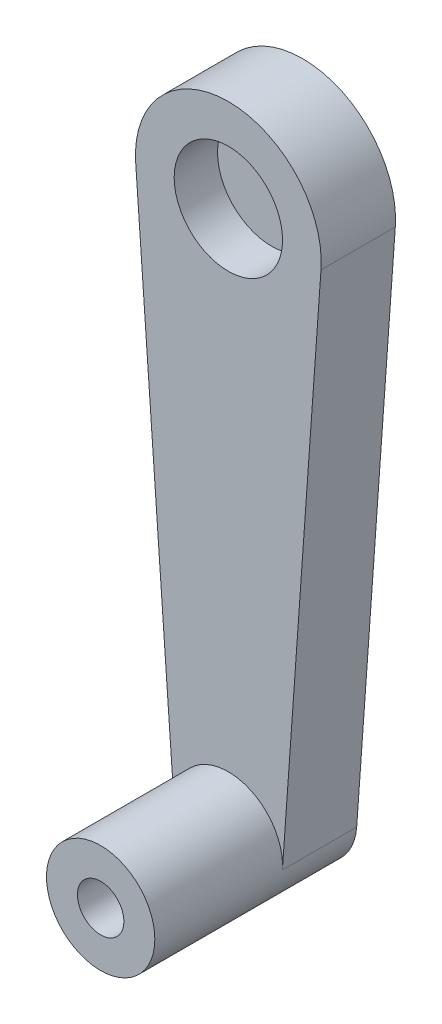
ISO-10303-21;
HEADER;
FILE_DESCRIPTION(('STEP AP214'),'2;1');
FILE_NAME('part.step','',(''),(''),'','','');
FILE_SCHEMA(('AUTOMOTIVE_DESIGN { 1 0 10303 214 1 1 1 1 }'));
ENDSEC;
DATA;
#1=APPLICATION_CONTEXT('core data for automotive mechanical design processes');
#2=APPLICATION_PROTOCOL_DEFINITION('international standard','automotive_design',2000,#1);
#3=PRODUCT_CONTEXT('',#1,'mechanical');
#4=PRODUCT('Part','Part','',(#3));
#5=PRODUCT_RELATED_PRODUCT_CATEGORY('part','',(#4));
#6=PRODUCT_DEFINITION_FORMATION('','',#4);
#7=PRODUCT_DEFINITION_CONTEXT('part definition',#1,'design');
#8=PRODUCT_DEFINITION('design','',#6,#7);
#9=PRODUCT_DEFINITION_SHAPE('','',#8);
#10=(LENGTH_UNIT() NAMED_UNIT(*) SI_UNIT(.MILLI.,.METRE.));
#11=(NAMED_UNIT(*) PLANE_ANGLE_UNIT() SI_UNIT($,.RADIAN.));
#12=(NAMED_UNIT(*) SI_UNIT($,.STERADIAN.) SOLID_ANGLE_UNIT());
#13=UNCERTAINTY_MEASURE_WITH_UNIT(LENGTH_MEASURE(1.E-05),#10,'distance_accuracy_value','');
#14=(GEOMETRIC_REPRESENTATION_CONTEXT(3) GLOBAL_UNCERTAINTY_ASSIGNED_CONTEXT((#13)) GLOBAL_UNIT_ASSIGNED_CONTEXT((#10,
#11,#12)) REPRESENTATION_CONTEXT('',''));
#15=CARTESIAN_POINT('',(0.,0.,0.));
#16=DIRECTION('',(0.,0.,1.));
#17=DIRECTION('',(1.,0.,0.));
#18=AXIS2_PLACEMENT_3D('',#15,#16,#17);
#19=CARTESIAN_POINT('',(0.,0.,8.25));
#20=DIRECTION('',(0.,0.,1.));
#21=DIRECTION('',(1.,0.,0.));
#22=AXIS2_PLACEMENT_3D('',#19,#20,#21);
#23=PLANE('',#22);
#24=CARTESIAN_POINT('',(0.,0.,8.25));
#25=DIRECTION('',(0.,0.,1.));
#26=DIRECTION('',(1.,0.,0.));
#27=AXIS2_PLACEMENT_3D('',#24,#25,#26);
#28=CIRCLE('',#27,3.5);
#29=CARTESIAN_POINT('',(3.5,0.,8.25));
#30=VERTEX_POINT('',#29);
#31=EDGE_CURVE('E11',#30,#30,#28,.T.);
#32=ORIENTED_EDGE('',*,*,#31,.T.);
#33=EDGE_LOOP('',(#32));
#34=FACE_BOUND('',#33,.T.);
#35=CARTESIAN_POINT('',(0.,0.,8.25));
#36=DIRECTION('',(0.,0.,1.));
#37=DIRECTION('',(1.,0.,0.));
#38=AXIS2_PLACEMENT_3D('',#35,#36,#37);
#39=CIRCLE('',#38,1.5);
#40=CARTESIAN_POINT('',(1.5,0.,8.25));
#41=VERTEX_POINT('',#40);
#42=EDGE_CURVE('E119',#41,#41,#39,.T.);
#43=ORIENTED_EDGE('',*,*,#42,.F.);
#44=EDGE_LOOP('',(#43));
#45=FACE_BOUND('',#44,.T.);
#46=ADVANCED_FACE('F37',(#34,#45),#23,.T.);
#47=CARTESIAN_POINT('',(0.,0.,8.25));
#48=DIRECTION('',(0.,0.,-1.));
#49=DIRECTION('',(-1.,0.,0.));
#50=AXIS2_PLACEMENT_3D('',#47,#48,#49);
#51=CYLINDRICAL_SURFACE('',#50,3.5);
#52=ORIENTED_EDGE('',*,*,#31,.F.);
#53=EDGE_LOOP('',(#52));
#54=FACE_BOUND('',#53,.T.);
#55=CARTESIAN_POINT('',(0.,0.,0.));
#56=DIRECTION('',(0.,0.,1.));
#57=DIRECTION('',(1.,0.,0.));
#58=AXIS2_PLACEMENT_3D('',#55,#56,#57);
#59=CIRCLE('',#58,3.5);
#60=CARTESIAN_POINT('',(3.49106001094224,-0.25,0.));
#61=VERTEX_POINT('',#60);
#62=CARTESIAN_POINT('',(-3.49106001094224,-0.25,0.));
#63=VERTEX_POINT('',#62);
#64=EDGE_CURVE('E41',#61,#63,#59,.T.);
#65=ORIENTED_EDGE('',*,*,#64,.T.);
#66=DIRECTION('',(0.,0.,1.));
#67=VECTOR('',#66,1.);
#68=CARTESIAN_POINT('',(-3.49106001094224,-0.25,-2.8));
#69=LINE('',#68,#67);
#70=CARTESIAN_POINT('',(-3.49106001094224,-0.250000000000001,-4.8));
#71=VERTEX_POINT('',#70);
#72=EDGE_CURVE('E77',#71,#63,#69,.T.);
#73=ORIENTED_EDGE('',*,*,#72,.F.);
#74=CARTESIAN_POINT('',(0.,0.,-4.8));
#75=DIRECTION('',(0.,0.,-1.));
#76=DIRECTION('',(-1.,0.,0.));
#77=AXIS2_PLACEMENT_3D('',#74,#75,#76);
#78=CIRCLE('',#77,3.5);
#79=CARTESIAN_POINT('',(3.49106001094224,-0.25,-4.8));
#80=VERTEX_POINT('',#79);
#81=EDGE_CURVE('E81',#80,#71,#78,.T.);
#82=ORIENTED_EDGE('',*,*,#81,.F.);
#83=DIRECTION('',(0.,0.,1.));
#84=VECTOR('',#83,1.);
#85=CARTESIAN_POINT('',(3.49106001094224,-0.25,-2.8));
#86=LINE('',#85,#84);
#87=EDGE_CURVE('E84',#80,#61,#86,.T.);
#88=ORIENTED_EDGE('',*,*,#87,.T.);
#89=EDGE_LOOP('',(#65,#73,#82,#88));
#90=FACE_BOUND('',#89,.T.);
#91=ADVANCED_FACE('F39',(#54,#90),#51,.T.);
#92=CARTESIAN_POINT('',(0.,0.,8.25));
#93=DIRECTION('',(0.,0.,-1.));
#94=DIRECTION('',(-1.,0.,0.));
#95=AXIS2_PLACEMENT_3D('',#92,#93,#94);
#96=CYLINDRICAL_SURFACE('',#95,1.5);
#97=ORIENTED_EDGE('',*,*,#42,.T.);
#98=EDGE_LOOP('',(#97));
#99=FACE_BOUND('',#98,.T.);
#100=CARTESIAN_POINT('',(0.,0.,0.));
#101=DIRECTION('',(0.,0.,1.));
#102=DIRECTION('',(1.,0.,0.));
#103=AXIS2_PLACEMENT_3D('',#100,#101,#102);
#104=CIRCLE('',#103,1.5);
#105=CARTESIAN_POINT('',(1.5,0.,0.));
#106=VERTEX_POINT('',#105);
#107=EDGE_CURVE('E118',#106,#106,#104,.T.);
#108=ORIENTED_EDGE('',*,*,#107,.F.);
#109=EDGE_LOOP('',(#108));
#110=FACE_BOUND('',#109,.T.);
#111=ADVANCED_FACE('F127',(#99,#110),#96,.F.);
#112=CARTESIAN_POINT('',(0.,0.,0.));
#113=DIRECTION('',(0.,0.,-1.));
#114=DIRECTION('',(-1.,0.,0.));
#115=AXIS2_PLACEMENT_3D('',#112,#113,#114);
#116=PLANE('',#115);
#117=ORIENTED_EDGE('',*,*,#107,.T.);
#118=EDGE_LOOP('',(#117));
#119=FACE_BOUND('',#118,.T.);
#120=ADVANCED_FACE('F125',(#119),#116,.F.);
#121=CARTESIAN_POINT('',(-3.49106001094224,-0.25,-2.8));
#122=DIRECTION('',(-0.997445717412067,-0.0714285714285714,0.));
#123=DIRECTION('',(0.0714285714285715,-0.997445717412067,0.));
#124=AXIS2_PLACEMENT_3D('',#121,#122,#123);
#125=PLANE('',#124);
#126=DIRECTION('',(0.0714285714285714,-0.997445717412067,0.));
#127=VECTOR('',#126,1.);
#128=CARTESIAN_POINT('',(-3.49106001094224,-0.25,0.));
#129=LINE('',#128,#127);
#130=CARTESIAN_POINT('',(-5.9846743044724,34.5714285714286,0.));
#131=VERTEX_POINT('',#130);
#132=EDGE_CURVE('E52',#131,#63,#129,.T.);
#133=ORIENTED_EDGE('',*,*,#132,.F.);
#134=DIRECTION('',(0.,0.,1.));
#135=VECTOR('',#134,1.);
#136=CARTESIAN_POINT('',(-5.9846743044724,34.5714285714286,-2.8));
#137=LINE('',#136,#135);
#138=CARTESIAN_POINT('',(-5.9846743044724,34.5714285714286,-4.8));
#139=VERTEX_POINT('',#138);
#140=EDGE_CURVE('E90',#139,#131,#137,.T.);
#141=ORIENTED_EDGE('',*,*,#140,.F.);
#142=DIRECTION('',(-0.0714285714285714,0.997445717412067,0.));
#143=VECTOR('',#142,1.);
#144=CARTESIAN_POINT('',(-3.49106001094224,-0.25,-4.8));
#145=LINE('',#144,#143);
#146=EDGE_CURVE('E88',#71,#139,#145,.T.);
#147=ORIENTED_EDGE('',*,*,#146,.F.);
#148=ORIENTED_EDGE('',*,*,#72,.T.);
#149=EDGE_LOOP('',(#133,#141,#147,#148));
#150=FACE_BOUND('',#149,.T.);
#151=ADVANCED_FACE('F89',(#150),#125,.T.);
#152=CARTESIAN_POINT('',(0.,35.,-2.8));
#153=DIRECTION('',(0.,0.,1.));
#154=DIRECTION('',(1.,0.,0.));
#155=AXIS2_PLACEMENT_3D('',#152,#153,#154);
#156=CYLINDRICAL_SURFACE('',#155,6.);
#157=CARTESIAN_POINT('',(0.,35.,0.));
#158=DIRECTION('',(0.,0.,-1.));
#159=DIRECTION('',(-1.,0.,0.));
#160=AXIS2_PLACEMENT_3D('',#157,#158,#159);
#161=CIRCLE('',#160,6.);
#162=CARTESIAN_POINT('',(5.9846743044724,34.5714285714286,0.));
#163=VERTEX_POINT('',#162);
#164=EDGE_CURVE('E107',#131,#163,#161,.T.);
#165=ORIENTED_EDGE('',*,*,#164,.T.);
#166=DIRECTION('',(0.,0.,1.));
#167=VECTOR('',#166,1.);
#168=CARTESIAN_POINT('',(5.9846743044724,34.5714285714286,-2.8));
#169=LINE('',#168,#167);
#170=CARTESIAN_POINT('',(5.9846743044724,34.5714285714286,-4.8));
#171=VERTEX_POINT('',#170);
#172=EDGE_CURVE('E114',#171,#163,#169,.T.);
#173=ORIENTED_EDGE('',*,*,#172,.F.);
#174=CARTESIAN_POINT('',(0.,35.,-4.8));
#175=DIRECTION('',(0.,0.,-1.));
#176=DIRECTION('',(-1.,0.,0.));
#177=AXIS2_PLACEMENT_3D('',#174,#175,#176);
#178=CIRCLE('',#177,6.);
#179=EDGE_CURVE('E94',#139,#171,#178,.T.);
#180=ORIENTED_EDGE('',*,*,#179,.F.);
#181=ORIENTED_EDGE('',*,*,#140,.T.);
#182=EDGE_LOOP('',(#165,#173,#180,#181));
#183=FACE_BOUND('',#182,.T.);
#184=ADVANCED_FACE('F165',(#183),#156,.T.);
#185=CARTESIAN_POINT('',(3.49106001094224,-0.25,-2.8));
#186=DIRECTION('',(-0.997445717412067,0.0714285714285714,0.));
#187=DIRECTION('',(-0.0714285714285714,-0.997445717412067,0.));
#188=AXIS2_PLACEMENT_3D('',#185,#186,#187);
#189=PLANE('',#188);
#190=DIRECTION('',(-0.0714285714285714,-0.997445717412067,0.));
#191=VECTOR('',#190,1.);
#192=CARTESIAN_POINT('',(3.49106001094224,-0.25,0.));
#193=LINE('',#192,#191);
#194=EDGE_CURVE('E109',#163,#61,#193,.T.);
#195=ORIENTED_EDGE('',*,*,#194,.T.);
#196=ORIENTED_EDGE('',*,*,#87,.F.);
#197=DIRECTION('',(0.0714285714285714,0.997445717412067,0.));
#198=VECTOR('',#197,1.);
#199=CARTESIAN_POINT('',(3.49106001094224,-0.25,-4.8));
#200=LINE('',#199,#198);
#201=EDGE_CURVE('E98',#80,#171,#200,.T.);
#202=ORIENTED_EDGE('',*,*,#201,.T.);
#203=ORIENTED_EDGE('',*,*,#172,.T.);
#204=EDGE_LOOP('',(#195,#196,#202,#203));
#205=FACE_BOUND('',#204,.T.);
#206=ADVANCED_FACE('F174',(#205),#189,.F.);
#207=CARTESIAN_POINT('',(0.,35.,-2.8));
#208=DIRECTION('',(0.,0.,1.));
#209=DIRECTION('',(1.,0.,0.));
#210=AXIS2_PLACEMENT_3D('',#207,#208,#209);
#211=CYLINDRICAL_SURFACE('',#210,3.5);
#212=CARTESIAN_POINT('',(0.,35.,-2.8));
#213=DIRECTION('',(0.,0.,-1.));
#214=DIRECTION('',(-1.,0.,0.));
#215=AXIS2_PLACEMENT_3D('',#212,#213,#214);
#216=CIRCLE('',#215,3.5);
#217=CARTESIAN_POINT('',(-3.5,35.,-2.8));
#218=VERTEX_POINT('',#217);
#219=EDGE_CURVE('E103',#218,#218,#216,.T.);
#220=ORIENTED_EDGE('',*,*,#219,.T.);
#221=EDGE_LOOP('',(#220));
#222=FACE_BOUND('',#221,.T.);
#223=CARTESIAN_POINT('',(0.,35.,0.));
#224=DIRECTION('',(0.,0.,-1.));
#225=DIRECTION('',(-1.,0.,0.));
#226=AXIS2_PLACEMENT_3D('',#223,#224,#225);
#227=CIRCLE('',#226,3.5);
#228=CARTESIAN_POINT('',(-3.5,35.,0.));
#229=VERTEX_POINT('',#228);
#230=EDGE_CURVE('E85',#229,#229,#227,.T.);
#231=ORIENTED_EDGE('',*,*,#230,.F.);
#232=EDGE_LOOP('',(#231));
#233=FACE_BOUND('',#232,.T.);
#234=ADVANCED_FACE('F185',(#222,#233),#211,.F.);
#235=ORIENTED_EDGE('',*,*,#64,.F.);
#236=ORIENTED_EDGE('',*,*,#194,.F.);
#237=ORIENTED_EDGE('',*,*,#164,.F.);
#238=ORIENTED_EDGE('',*,*,#132,.T.);
#239=EDGE_LOOP('',(#235,#236,#237,#238));
#240=FACE_BOUND('',#239,.T.);
#241=ORIENTED_EDGE('',*,*,#230,.T.);
#242=EDGE_LOOP('',(#241));
#243=FACE_BOUND('',#242,.T.);
#244=ADVANCED_FACE('F136',(#240,#243),#116,.F.);
#245=CARTESIAN_POINT('',(0.,0.,-2.8));
#246=DIRECTION('',(0.,0.,-1.));
#247=DIRECTION('',(-1.,0.,0.));
#248=AXIS2_PLACEMENT_3D('',#245,#246,#247);
#249=PLANE('',#248);
#250=ORIENTED_EDGE('',*,*,#219,.F.);
#251=EDGE_LOOP('',(#250));
#252=FACE_BOUND('',#251,.T.);
#253=ADVANCED_FACE('F194',(#252),#249,.F.);
#254=CARTESIAN_POINT('',(0.,0.,-4.8));
#255=DIRECTION('',(0.,0.,-1.));
#256=DIRECTION('',(-1.,0.,0.));
#257=AXIS2_PLACEMENT_3D('',#254,#255,#256);
#258=PLANE('',#257);
#259=ORIENTED_EDGE('',*,*,#81,.T.);
#260=ORIENTED_EDGE('',*,*,#146,.T.);
#261=ORIENTED_EDGE('',*,*,#179,.T.);
#262=ORIENTED_EDGE('',*,*,#201,.F.);
#263=EDGE_LOOP('',(#259,#260,#261,#262));
#264=FACE_BOUND('',#263,.T.);
#265=ADVANCED_FACE('F96',(#264),#258,.T.);
#266=CLOSED_SHELL('',(#46,#91,#111,#120,#151,#184,#206,#234,#244,#253,#265));
#267=MANIFOLD_SOLID_BREP('B2',#266);
#268=ADVANCED_BREP_SHAPE_REPRESENTATION('',(#18,#267),#14);
#269=SHAPE_DEFINITION_REPRESENTATION(#9,#268);
ENDSEC;
END-ISO-10303-21;
